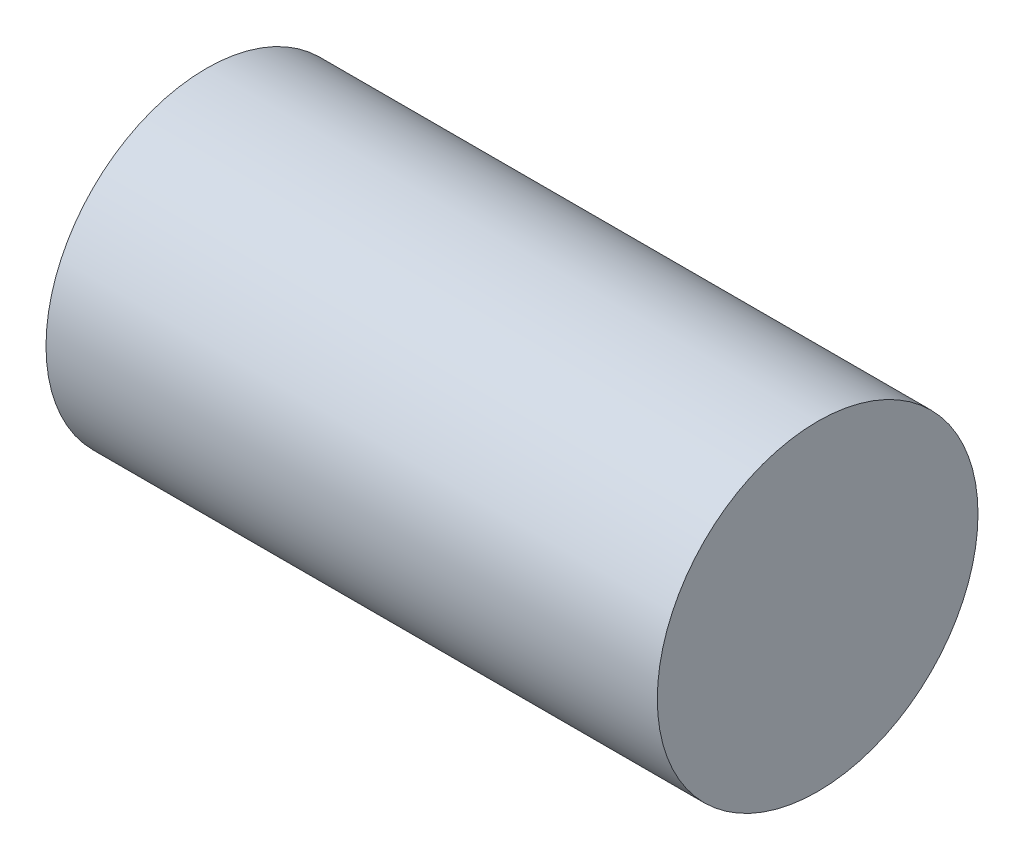
ISO-10303-21;
HEADER;
FILE_DESCRIPTION(('STEP AP214'),'2;1');
FILE_NAME('part.step','',(''),(''),'','','');
FILE_SCHEMA(('AUTOMOTIVE_DESIGN { 1 0 10303 214 1 1 1 1 }'));
ENDSEC;
DATA;
#1=APPLICATION_CONTEXT('core data for automotive mechanical design processes');
#2=APPLICATION_PROTOCOL_DEFINITION('international standard','automotive_design',2000,#1);
#3=PRODUCT_CONTEXT('',#1,'mechanical');
#4=PRODUCT('Part','Part','',(#3));
#5=PRODUCT_RELATED_PRODUCT_CATEGORY('part','',(#4));
#6=PRODUCT_DEFINITION_FORMATION('','',#4);
#7=PRODUCT_DEFINITION_CONTEXT('part definition',#1,'design');
#8=PRODUCT_DEFINITION('design','',#6,#7);
#9=PRODUCT_DEFINITION_SHAPE('','',#8);
#10=(LENGTH_UNIT() NAMED_UNIT(*) SI_UNIT(.MILLI.,.METRE.));
#11=(NAMED_UNIT(*) PLANE_ANGLE_UNIT() SI_UNIT($,.RADIAN.));
#12=(NAMED_UNIT(*) SI_UNIT($,.STERADIAN.) SOLID_ANGLE_UNIT());
#13=UNCERTAINTY_MEASURE_WITH_UNIT(LENGTH_MEASURE(1.E-05),#10,'distance_accuracy_value','');
#14=(GEOMETRIC_REPRESENTATION_CONTEXT(3) GLOBAL_UNCERTAINTY_ASSIGNED_CONTEXT((#13)) GLOBAL_UNIT_ASSIGNED_CONTEXT((#10,
#11,#12)) REPRESENTATION_CONTEXT('',''));
#15=CARTESIAN_POINT('',(0.,0.,0.));
#16=DIRECTION('',(0.,0.,1.));
#17=DIRECTION('',(1.,0.,0.));
#18=AXIS2_PLACEMENT_3D('',#15,#16,#17);
#19=CARTESIAN_POINT('',(61.,0.,0.));
#20=DIRECTION('',(-1.,0.,0.));
#21=DIRECTION('',(0.,0.,1.));
#22=AXIS2_PLACEMENT_3D('',#19,#20,#21);
#23=CYLINDRICAL_SURFACE('',#22,16.);
#24=CARTESIAN_POINT('',(61.,0.,0.));
#25=DIRECTION('',(1.,0.,0.));
#26=DIRECTION('',(0.,0.,-1.));
#27=AXIS2_PLACEMENT_3D('',#24,#25,#26);
#28=CIRCLE('',#27,16.);
#29=CARTESIAN_POINT('',(61.,0.,16.));
#30=VERTEX_POINT('',#29);
#31=EDGE_CURVE('E40',#30,#30,#28,.T.);
#32=CARTESIAN_POINT('',(0.,0.,0.));
#33=DIRECTION('',(1.,0.,0.));
#34=DIRECTION('',(0.,0.,-1.));
#35=AXIS2_PLACEMENT_3D('',#32,#33,#34);
#36=CIRCLE('',#35,16.);
#37=CARTESIAN_POINT('',(0.,0.,16.));
#38=VERTEX_POINT('',#37);
#39=EDGE_CURVE('E36',#38,#38,#36,.T.);
#40=CARTESIAN_POINT('',(61.,0.,16.));
#41=CARTESIAN_POINT('',(60.3645833333333,0.,16.));
#42=CARTESIAN_POINT('',(59.7291666666667,0.,16.));
#43=CARTESIAN_POINT('',(58.4583333333333,0.,16.));
#44=CARTESIAN_POINT('',(57.8229166666667,0.,16.));
#45=CARTESIAN_POINT('',(56.5520833333333,0.,16.));
#46=CARTESIAN_POINT('',(55.9166666666667,0.,16.));
#47=CARTESIAN_POINT('',(54.6458333333333,0.,16.));
#48=CARTESIAN_POINT('',(54.0104166666667,0.,16.));
#49=CARTESIAN_POINT('',(52.7395833333333,0.,16.));
#50=CARTESIAN_POINT('',(52.1041666666667,0.,16.));
#51=CARTESIAN_POINT('',(50.8333333333333,0.,16.));
#52=CARTESIAN_POINT('',(50.1979166666667,0.,16.));
#53=CARTESIAN_POINT('',(48.9270833333333,0.,16.));
#54=CARTESIAN_POINT('',(48.2916666666667,0.,16.));
#55=CARTESIAN_POINT('',(47.0208333333333,0.,16.));
#56=CARTESIAN_POINT('',(46.3854166666667,0.,16.));
#57=CARTESIAN_POINT('',(45.1145833333333,0.,16.));
#58=CARTESIAN_POINT('',(44.4791666666667,0.,16.));
#59=CARTESIAN_POINT('',(43.2083333333333,0.,16.));
#60=CARTESIAN_POINT('',(42.5729166666667,0.,16.));
#61=CARTESIAN_POINT('',(41.3020833333333,0.,16.));
#62=CARTESIAN_POINT('',(40.6666666666667,0.,16.));
#63=CARTESIAN_POINT('',(39.3958333333333,0.,16.));
#64=CARTESIAN_POINT('',(38.7604166666667,0.,16.));
#65=CARTESIAN_POINT('',(37.4895833333333,0.,16.));
#66=CARTESIAN_POINT('',(36.8541666666667,0.,16.));
#67=CARTESIAN_POINT('',(35.5833333333333,0.,16.));
#68=CARTESIAN_POINT('',(34.9479166666667,0.,16.));
#69=CARTESIAN_POINT('',(33.6770833333333,0.,16.));
#70=CARTESIAN_POINT('',(33.0416666666667,0.,16.));
#71=CARTESIAN_POINT('',(31.7708333333333,0.,16.));
#72=CARTESIAN_POINT('',(31.1354166666667,0.,16.));
#73=CARTESIAN_POINT('',(29.8645833333333,0.,16.));
#74=CARTESIAN_POINT('',(29.2291666666667,0.,16.));
#75=CARTESIAN_POINT('',(27.9583333333333,0.,16.));
#76=CARTESIAN_POINT('',(27.3229166666667,0.,16.));
#77=CARTESIAN_POINT('',(26.0520833333333,0.,16.));
#78=CARTESIAN_POINT('',(25.4166666666667,0.,16.));
#79=CARTESIAN_POINT('',(24.1458333333333,0.,16.));
#80=CARTESIAN_POINT('',(23.5104166666667,0.,16.));
#81=CARTESIAN_POINT('',(22.2395833333333,0.,16.));
#82=CARTESIAN_POINT('',(21.6041666666667,0.,16.));
#83=CARTESIAN_POINT('',(20.3333333333333,0.,16.));
#84=CARTESIAN_POINT('',(19.6979166666667,0.,16.));
#85=CARTESIAN_POINT('',(18.4270833333333,0.,16.));
#86=CARTESIAN_POINT('',(17.7916666666667,0.,16.));
#87=CARTESIAN_POINT('',(16.5208333333333,0.,16.));
#88=CARTESIAN_POINT('',(15.8854166666667,0.,16.));
#89=CARTESIAN_POINT('',(14.6145833333333,0.,16.));
#90=CARTESIAN_POINT('',(13.9791666666667,0.,16.));
#91=CARTESIAN_POINT('',(12.7083333333333,0.,16.));
#92=CARTESIAN_POINT('',(12.0729166666667,0.,16.));
#93=CARTESIAN_POINT('',(10.8020833333333,0.,16.));
#94=CARTESIAN_POINT('',(10.1666666666667,0.,16.));
#95=CARTESIAN_POINT('',(8.89583333333333,0.,16.));
#96=CARTESIAN_POINT('',(8.26041666666666,0.,16.));
#97=CARTESIAN_POINT('',(6.98958333333333,0.,16.));
#98=CARTESIAN_POINT('',(6.35416666666666,0.,16.));
#99=CARTESIAN_POINT('',(5.08333333333333,0.,16.));
#100=CARTESIAN_POINT('',(4.44791666666666,0.,16.));
#101=CARTESIAN_POINT('',(3.17708333333333,0.,16.));
#102=CARTESIAN_POINT('',(2.54166666666666,0.,16.));
#103=CARTESIAN_POINT('',(1.27083333333332,0.,16.));
#104=CARTESIAN_POINT('',(0.635416666666658,0.,16.));
#105=CARTESIAN_POINT('',(0.,0.,16.));
#106=B_SPLINE_CURVE_WITH_KNOTS('',3,(#40,#41,#42,#43,#44,#45,#46,#47,#48,#49,#50,#51,#52,#53,
#54,#55,#56,#57,#58,#59,#60,#61,#62,#63,#64,#65,#66,#67,#68,#69,#70,#71,#72,#73,#74,#75,#76,#77,
#78,#79,#80,#81,#82,#83,#84,#85,#86,#87,#88,#89,#90,#91,#92,#93,#94,#95,#96,#97,#98,#99,#100,
#101,#102,#103,#104,#105),.UNSPECIFIED.,.F.,.F.,(4,2,2,2,2,2,2,2,2,2,2,2,2,2,2,2,2,2,2,2,2,2,2,
2,2,2,2,2,2,2,2,2,4),(0.,1.90625000000001,3.8125,5.71875,7.62500000000001,9.53125000000001,
11.4375,13.34375,15.25,17.15625,19.0625,20.96875,22.875,24.78125,26.6875,28.59375,30.5,32.40625,
34.3125,36.21875,38.125,40.03125,41.9375,43.84375,45.75,47.65625,49.5625,51.46875,53.375,
55.28125,57.1875,59.09375,61.),.UNSPECIFIED.);
#107=EDGE_CURVE('BSEAM33',#30,#38,#106,.T.);
#108=ORIENTED_EDGE('',*,*,#31,.F.);
#109=ORIENTED_EDGE('',*,*,#39,.T.);
#110=ORIENTED_EDGE('',*,*,#107,.T.);
#111=ORIENTED_EDGE('',*,*,#107,.F.);
#112=EDGE_LOOP('',(#108,#110,#109,#111));
#113=FACE_BOUND('',#112,.T.);
#114=ADVANCED_FACE('F33',(#113),#23,.T.);
#115=CARTESIAN_POINT('',(61.,0.,0.));
#116=DIRECTION('',(1.,0.,0.));
#117=DIRECTION('',(0.,0.,-1.));
#118=AXIS2_PLACEMENT_3D('',#115,#116,#117);
#119=PLANE('',#118);
#120=ORIENTED_EDGE('',*,*,#31,.T.);
#121=EDGE_LOOP('',(#120));
#122=FACE_BOUND('',#121,.T.);
#123=ADVANCED_FACE('F115',(#122),#119,.T.);
#124=CARTESIAN_POINT('',(0.,0.,0.));
#125=DIRECTION('',(1.,0.,0.));
#126=DIRECTION('',(0.,0.,-1.));
#127=AXIS2_PLACEMENT_3D('',#124,#125,#126);
#128=PLANE('',#127);
#129=CARTESIAN_POINT('',(0.,13.5,0.));
#130=DIRECTION('',(-1.,0.,0.));
#131=DIRECTION('',(0.,0.,1.));
#132=AXIS2_PLACEMENT_3D('',#129,#130,#131);
#133=CIRCLE('',#132,1.5);
#134=CARTESIAN_POINT('',(0.,13.5,1.5));
#135=VERTEX_POINT('',#134);
#136=EDGE_CURVE('E75',#135,#135,#133,.T.);
#137=ORIENTED_EDGE('',*,*,#136,.F.);
#138=EDGE_LOOP('',(#137));
#139=FACE_BOUND('',#138,.T.);
#140=CARTESIAN_POINT('',(0.,6.74999999999933,-11.6913429510895));
#141=DIRECTION('',(-1.,0.,0.));
#142=DIRECTION('',(0.,0.,1.));
#143=AXIS2_PLACEMENT_3D('',#140,#141,#142);
#144=CIRCLE('',#143,1.50000000000072);
#145=CARTESIAN_POINT('',(0.,6.74999999999933,-10.1913429510888));
#146=VERTEX_POINT('',#145);
#147=EDGE_CURVE('E76',#146,#146,#144,.T.);
#148=ORIENTED_EDGE('',*,*,#147,.F.);
#149=EDGE_LOOP('',(#148));
#150=FACE_BOUND('',#149,.T.);
#151=CARTESIAN_POINT('',(0.,-6.75000000000067,-11.6913429510888));
#152=DIRECTION('',(-1.,0.,0.));
#153=DIRECTION('',(0.,0.,1.));
#154=AXIS2_PLACEMENT_3D('',#151,#152,#153);
#155=CIRCLE('',#154,1.50000000000141);
#156=CARTESIAN_POINT('',(0.,-6.75000000000067,-10.1913429510874));
#157=VERTEX_POINT('',#156);
#158=EDGE_CURVE('E50',#157,#157,#155,.T.);
#159=ORIENTED_EDGE('',*,*,#158,.F.);
#160=EDGE_LOOP('',(#159));
#161=FACE_BOUND('',#160,.T.);
#162=CARTESIAN_POINT('',(0.,-13.5,1.52981248970527E-12));
#163=DIRECTION('',(-1.,0.,0.));
#164=DIRECTION('',(0.,0.,1.));
#165=AXIS2_PLACEMENT_3D('',#162,#163,#164);
#166=CIRCLE('',#165,1.50000000000155);
#167=CARTESIAN_POINT('',(0.,-13.5,1.50000000000308));
#168=VERTEX_POINT('',#167);
#169=EDGE_CURVE('E57',#168,#168,#166,.T.);
#170=ORIENTED_EDGE('',*,*,#169,.F.);
#171=EDGE_LOOP('',(#170));
#172=FACE_BOUND('',#171,.T.);
#173=CARTESIAN_POINT('',(0.,-6.74999999999934,11.6913429510911));
#174=DIRECTION('',(-1.,0.,0.));
#175=DIRECTION('',(0.,0.,1.));
#176=AXIS2_PLACEMENT_3D('',#173,#174,#175);
#177=CIRCLE('',#176,1.50000000000097);
#178=CARTESIAN_POINT('',(0.,-6.74999999999934,13.191342951092));
#179=VERTEX_POINT('',#178);
#180=EDGE_CURVE('E63',#179,#179,#177,.T.);
#181=ORIENTED_EDGE('',*,*,#180,.F.);
#182=EDGE_LOOP('',(#181));
#183=FACE_BOUND('',#182,.T.);
#184=CARTESIAN_POINT('',(0.,6.75000000000067,11.6913429510903));
#185=DIRECTION('',(-1.,0.,0.));
#186=DIRECTION('',(0.,0.,1.));
#187=AXIS2_PLACEMENT_3D('',#184,#185,#186);
#188=CIRCLE('',#187,1.50000000000021);
#189=CARTESIAN_POINT('',(0.,6.75000000000067,13.1913429510905));
#190=VERTEX_POINT('',#189);
#191=EDGE_CURVE('E69',#190,#190,#188,.T.);
#192=ORIENTED_EDGE('',*,*,#191,.F.);
#193=EDGE_LOOP('',(#192));
#194=FACE_BOUND('',#193,.T.);
#195=CARTESIAN_POINT('',(0.,0.,0.));
#196=DIRECTION('',(-1.,0.,0.));
#197=DIRECTION('',(0.,0.,1.));
#198=AXIS2_PLACEMENT_3D('',#195,#196,#197);
#199=CIRCLE('',#198,11.);
#200=CARTESIAN_POINT('',(0.,0.,11.));
#201=VERTEX_POINT('',#200);
#202=EDGE_CURVE('E10',#201,#201,#199,.T.);
#203=ORIENTED_EDGE('',*,*,#202,.F.);
#204=EDGE_LOOP('',(#203));
#205=FACE_BOUND('',#204,.T.);
#206=ORIENTED_EDGE('',*,*,#39,.F.);
#207=EDGE_LOOP('',(#206));
#208=FACE_BOUND('',#207,.T.);
#209=ADVANCED_FACE('F110',(#139,#150,#161,#172,#183,#194,#205,#208),#128,.F.);
#210=CARTESIAN_POINT('',(-2.,0.,0.));
#211=DIRECTION('',(1.,0.,0.));
#212=DIRECTION('',(0.,0.,-1.));
#213=AXIS2_PLACEMENT_3D('',#210,#211,#212);
#214=CYLINDRICAL_SURFACE('',#213,11.);
#215=CARTESIAN_POINT('',(-2.,0.,0.));
#216=DIRECTION('',(-1.,0.,0.));
#217=DIRECTION('',(0.,0.,1.));
#218=AXIS2_PLACEMENT_3D('',#215,#216,#217);
#219=CIRCLE('',#218,11.);
#220=CARTESIAN_POINT('',(-2.,0.,11.));
#221=VERTEX_POINT('',#220);
#222=EDGE_CURVE('E46',#221,#221,#219,.T.);
#223=ORIENTED_EDGE('',*,*,#222,.F.);
#224=EDGE_LOOP('',(#223));
#225=FACE_BOUND('',#224,.T.);
#226=ORIENTED_EDGE('',*,*,#202,.T.);
#227=EDGE_LOOP('',(#226));
#228=FACE_BOUND('',#227,.T.);
#229=ADVANCED_FACE('F105',(#225,#228),#214,.T.);
#230=CARTESIAN_POINT('',(-2.,0.,0.));
#231=DIRECTION('',(-1.,0.,0.));
#232=DIRECTION('',(0.,0.,1.));
#233=AXIS2_PLACEMENT_3D('',#230,#231,#232);
#234=PLANE('',#233);
#235=CARTESIAN_POINT('',(-2.,0.,0.));
#236=DIRECTION('',(-1.,0.,0.));
#237=DIRECTION('',(0.,0.,1.));
#238=AXIS2_PLACEMENT_3D('',#235,#236,#237);
#239=CIRCLE('',#238,2.5);
#240=CARTESIAN_POINT('',(-2.,0.,2.5));
#241=VERTEX_POINT('',#240);
#242=EDGE_CURVE('E86',#241,#241,#239,.T.);
#243=ORIENTED_EDGE('',*,*,#242,.F.);
#244=EDGE_LOOP('',(#243));
#245=FACE_BOUND('',#244,.T.);
#246=ORIENTED_EDGE('',*,*,#222,.T.);
#247=EDGE_LOOP('',(#246));
#248=FACE_BOUND('',#247,.T.);
#249=ADVANCED_FACE('F101',(#245,#248),#234,.T.);
#250=CARTESIAN_POINT('',(4.,6.75000000000067,11.6913429510903));
#251=DIRECTION('',(-1.,0.,0.));
#252=DIRECTION('',(0.,0.,1.));
#253=AXIS2_PLACEMENT_3D('',#250,#251,#252);
#254=CYLINDRICAL_SURFACE('',#253,1.50000000000021);
#255=CARTESIAN_POINT('',(4.,6.75000000000067,11.6913429510903));
#256=DIRECTION('',(-1.,0.,0.));
#257=DIRECTION('',(0.,0.,1.));
#258=AXIS2_PLACEMENT_3D('',#255,#256,#257);
#259=CIRCLE('',#258,1.50000000000021);
#260=CARTESIAN_POINT('',(4.,6.75000000000067,13.1913429510905));
#261=VERTEX_POINT('',#260);
#262=EDGE_CURVE('E72',#261,#261,#259,.T.);
#263=ORIENTED_EDGE('',*,*,#262,.F.);
#264=EDGE_LOOP('',(#263));
#265=FACE_BOUND('',#264,.T.);
#266=ORIENTED_EDGE('',*,*,#191,.T.);
#267=EDGE_LOOP('',(#266));
#268=FACE_BOUND('',#267,.T.);
#269=ADVANCED_FACE('F104',(#265,#268),#254,.F.);
#270=CARTESIAN_POINT('',(4.,6.75000000000067,11.6913429510903));
#271=DIRECTION('',(-1.,0.,0.));
#272=DIRECTION('',(0.,0.,1.));
#273=AXIS2_PLACEMENT_3D('',#270,#271,#272);
#274=PLANE('',#273);
#275=ORIENTED_EDGE('',*,*,#262,.T.);
#276=EDGE_LOOP('',(#275));
#277=FACE_BOUND('',#276,.T.);
#278=ADVANCED_FACE('F146',(#277),#274,.T.);
#279=CARTESIAN_POINT('',(4.,-6.74999999999934,11.6913429510911));
#280=DIRECTION('',(-1.,0.,0.));
#281=DIRECTION('',(0.,0.,1.));
#282=AXIS2_PLACEMENT_3D('',#279,#280,#281);
#283=CYLINDRICAL_SURFACE('',#282,1.50000000000097);
#284=CARTESIAN_POINT('',(4.,-6.74999999999934,11.6913429510911));
#285=DIRECTION('',(-1.,0.,0.));
#286=DIRECTION('',(0.,0.,1.));
#287=AXIS2_PLACEMENT_3D('',#284,#285,#286);
#288=CIRCLE('',#287,1.50000000000097);
#289=CARTESIAN_POINT('',(4.,-6.74999999999934,13.191342951092));
#290=VERTEX_POINT('',#289);
#291=EDGE_CURVE('E66',#290,#290,#288,.T.);
#292=ORIENTED_EDGE('',*,*,#291,.F.);
#293=EDGE_LOOP('',(#292));
#294=FACE_BOUND('',#293,.T.);
#295=ORIENTED_EDGE('',*,*,#180,.T.);
#296=EDGE_LOOP('',(#295));
#297=FACE_BOUND('',#296,.T.);
#298=ADVANCED_FACE('F157',(#294,#297),#283,.F.);
#299=CARTESIAN_POINT('',(4.,-6.74999999999934,11.6913429510911));
#300=DIRECTION('',(-1.,0.,0.));
#301=DIRECTION('',(0.,0.,1.));
#302=AXIS2_PLACEMENT_3D('',#299,#300,#301);
#303=PLANE('',#302);
#304=ORIENTED_EDGE('',*,*,#291,.T.);
#305=EDGE_LOOP('',(#304));
#306=FACE_BOUND('',#305,.T.);
#307=ADVANCED_FACE('F167',(#306),#303,.T.);
#308=CARTESIAN_POINT('',(4.,-13.5,1.52981248970527E-12));
#309=DIRECTION('',(-1.,0.,0.));
#310=DIRECTION('',(0.,0.,1.));
#311=AXIS2_PLACEMENT_3D('',#308,#309,#310);
#312=CYLINDRICAL_SURFACE('',#311,1.50000000000155);
#313=CARTESIAN_POINT('',(4.,-13.5,1.52981248970527E-12));
#314=DIRECTION('',(-1.,0.,0.));
#315=DIRECTION('',(0.,0.,1.));
#316=AXIS2_PLACEMENT_3D('',#313,#314,#315);
#317=CIRCLE('',#316,1.50000000000155);
#318=CARTESIAN_POINT('',(4.,-13.5,1.50000000000308));
#319=VERTEX_POINT('',#318);
#320=EDGE_CURVE('E60',#319,#319,#317,.T.);
#321=ORIENTED_EDGE('',*,*,#320,.F.);
#322=EDGE_LOOP('',(#321));
#323=FACE_BOUND('',#322,.T.);
#324=ORIENTED_EDGE('',*,*,#169,.T.);
#325=EDGE_LOOP('',(#324));
#326=FACE_BOUND('',#325,.T.);
#327=ADVANCED_FACE('F177',(#323,#326),#312,.F.);
#328=CARTESIAN_POINT('',(4.,-13.5,1.52981248970527E-12));
#329=DIRECTION('',(-1.,0.,0.));
#330=DIRECTION('',(0.,0.,1.));
#331=AXIS2_PLACEMENT_3D('',#328,#329,#330);
#332=PLANE('',#331);
#333=ORIENTED_EDGE('',*,*,#320,.T.);
#334=EDGE_LOOP('',(#333));
#335=FACE_BOUND('',#334,.T.);
#336=ADVANCED_FACE('F187',(#335),#332,.T.);
#337=CARTESIAN_POINT('',(4.,-6.75000000000067,-11.6913429510888));
#338=DIRECTION('',(-1.,0.,0.));
#339=DIRECTION('',(0.,0.,1.));
#340=AXIS2_PLACEMENT_3D('',#337,#338,#339);
#341=CYLINDRICAL_SURFACE('',#340,1.50000000000141);
#342=CARTESIAN_POINT('',(4.,-6.75000000000067,-11.6913429510888));
#343=DIRECTION('',(-1.,0.,0.));
#344=DIRECTION('',(0.,0.,1.));
#345=AXIS2_PLACEMENT_3D('',#342,#343,#344);
#346=CIRCLE('',#345,1.50000000000141);
#347=CARTESIAN_POINT('',(4.,-6.75000000000067,-10.1913429510874));
#348=VERTEX_POINT('',#347);
#349=EDGE_CURVE('E53',#348,#348,#346,.T.);
#350=ORIENTED_EDGE('',*,*,#349,.F.);
#351=EDGE_LOOP('',(#350));
#352=FACE_BOUND('',#351,.T.);
#353=ORIENTED_EDGE('',*,*,#158,.T.);
#354=EDGE_LOOP('',(#353));
#355=FACE_BOUND('',#354,.T.);
#356=ADVANCED_FACE('F197',(#352,#355),#341,.F.);
#357=CARTESIAN_POINT('',(4.,-6.75000000000067,-11.6913429510888));
#358=DIRECTION('',(-1.,0.,0.));
#359=DIRECTION('',(0.,0.,1.));
#360=AXIS2_PLACEMENT_3D('',#357,#358,#359);
#361=PLANE('',#360);
#362=ORIENTED_EDGE('',*,*,#349,.T.);
#363=EDGE_LOOP('',(#362));
#364=FACE_BOUND('',#363,.T.);
#365=ADVANCED_FACE('F207',(#364),#361,.T.);
#366=CARTESIAN_POINT('',(4.,6.74999999999933,-11.6913429510895));
#367=DIRECTION('',(-1.,0.,0.));
#368=DIRECTION('',(0.,0.,1.));
#369=AXIS2_PLACEMENT_3D('',#366,#367,#368);
#370=CYLINDRICAL_SURFACE('',#369,1.50000000000072);
#371=CARTESIAN_POINT('',(4.,6.74999999999933,-11.6913429510895));
#372=DIRECTION('',(-1.,0.,0.));
#373=DIRECTION('',(0.,0.,1.));
#374=AXIS2_PLACEMENT_3D('',#371,#372,#373);
#375=CIRCLE('',#374,1.50000000000072);
#376=CARTESIAN_POINT('',(4.,6.74999999999933,-10.1913429510888));
#377=VERTEX_POINT('',#376);
#378=EDGE_CURVE('E54',#377,#377,#375,.T.);
#379=ORIENTED_EDGE('',*,*,#378,.F.);
#380=EDGE_LOOP('',(#379));
#381=FACE_BOUND('',#380,.T.);
#382=ORIENTED_EDGE('',*,*,#147,.T.);
#383=EDGE_LOOP('',(#382));
#384=FACE_BOUND('',#383,.T.);
#385=ADVANCED_FACE('F217',(#381,#384),#370,.F.);
#386=CARTESIAN_POINT('',(4.,6.74999999999933,-11.6913429510895));
#387=DIRECTION('',(-1.,0.,0.));
#388=DIRECTION('',(0.,0.,1.));
#389=AXIS2_PLACEMENT_3D('',#386,#387,#388);
#390=PLANE('',#389);
#391=ORIENTED_EDGE('',*,*,#378,.T.);
#392=EDGE_LOOP('',(#391));
#393=FACE_BOUND('',#392,.T.);
#394=ADVANCED_FACE('F227',(#393),#390,.T.);
#395=CARTESIAN_POINT('',(4.,13.5,0.));
#396=DIRECTION('',(-1.,0.,0.));
#397=DIRECTION('',(0.,0.,1.));
#398=AXIS2_PLACEMENT_3D('',#395,#396,#397);
#399=CYLINDRICAL_SURFACE('',#398,1.5);
#400=CARTESIAN_POINT('',(4.,13.5,0.));
#401=DIRECTION('',(-1.,0.,0.));
#402=DIRECTION('',(0.,0.,1.));
#403=AXIS2_PLACEMENT_3D('',#400,#401,#402);
#404=CIRCLE('',#403,1.5);
#405=CARTESIAN_POINT('',(4.,13.5,1.5));
#406=VERTEX_POINT('',#405);
#407=EDGE_CURVE('E49',#406,#406,#404,.T.);
#408=ORIENTED_EDGE('',*,*,#407,.F.);
#409=EDGE_LOOP('',(#408));
#410=FACE_BOUND('',#409,.T.);
#411=ORIENTED_EDGE('',*,*,#136,.T.);
#412=EDGE_LOOP('',(#411));
#413=FACE_BOUND('',#412,.T.);
#414=ADVANCED_FACE('F237',(#410,#413),#399,.F.);
#415=CARTESIAN_POINT('',(4.,13.5,0.));
#416=DIRECTION('',(-1.,0.,0.));
#417=DIRECTION('',(0.,0.,1.));
#418=AXIS2_PLACEMENT_3D('',#415,#416,#417);
#419=PLANE('',#418);
#420=ORIENTED_EDGE('',*,*,#407,.T.);
#421=EDGE_LOOP('',(#420));
#422=FACE_BOUND('',#421,.T.);
#423=ADVANCED_FACE('F97',(#422),#419,.T.);
#424=CARTESIAN_POINT('',(0.,0.,0.));
#425=DIRECTION('',(-1.,0.,0.));
#426=DIRECTION('',(0.,0.,1.));
#427=AXIS2_PLACEMENT_3D('',#424,#425,#426);
#428=CYLINDRICAL_SURFACE('',#427,2.5);
#429=CARTESIAN_POINT('',(0.,0.,0.));
#430=DIRECTION('',(-1.,0.,0.));
#431=DIRECTION('',(0.,0.,1.));
#432=AXIS2_PLACEMENT_3D('',#429,#430,#431);
#433=CIRCLE('',#432,2.5);
#434=CARTESIAN_POINT('',(0.,0.,2.5));
#435=VERTEX_POINT('',#434);
#436=EDGE_CURVE('E79',#435,#435,#433,.T.);
#437=ORIENTED_EDGE('',*,*,#436,.F.);
#438=EDGE_LOOP('',(#437));
#439=FACE_BOUND('',#438,.T.);
#440=ORIENTED_EDGE('',*,*,#242,.T.);
#441=EDGE_LOOP('',(#440));
#442=FACE_BOUND('',#441,.T.);
#443=ADVANCED_FACE('F94',(#439,#442),#428,.F.);
#444=CARTESIAN_POINT('',(0.,0.,0.));
#445=DIRECTION('',(-1.,0.,0.));
#446=DIRECTION('',(0.,0.,1.));
#447=AXIS2_PLACEMENT_3D('',#444,#445,#446);
#448=PLANE('',#447);
#449=ORIENTED_EDGE('',*,*,#436,.T.);
#450=EDGE_LOOP('',(#449));
#451=FACE_BOUND('',#450,.T.);
#452=ADVANCED_FACE('F92',(#451),#448,.T.);
#453=CLOSED_SHELL('',(#114,#123,#209,#229,#249,#269,#278,#298,#307,#327,#336,#356,#365,#385,
#394,#414,#423,#443,#452));
#454=MANIFOLD_SOLID_BREP('B2',#453);
#455=ADVANCED_BREP_SHAPE_REPRESENTATION('',(#18,#454),#14);
#456=SHAPE_DEFINITION_REPRESENTATION(#9,#455);
ENDSEC;
END-ISO-10303-21;
